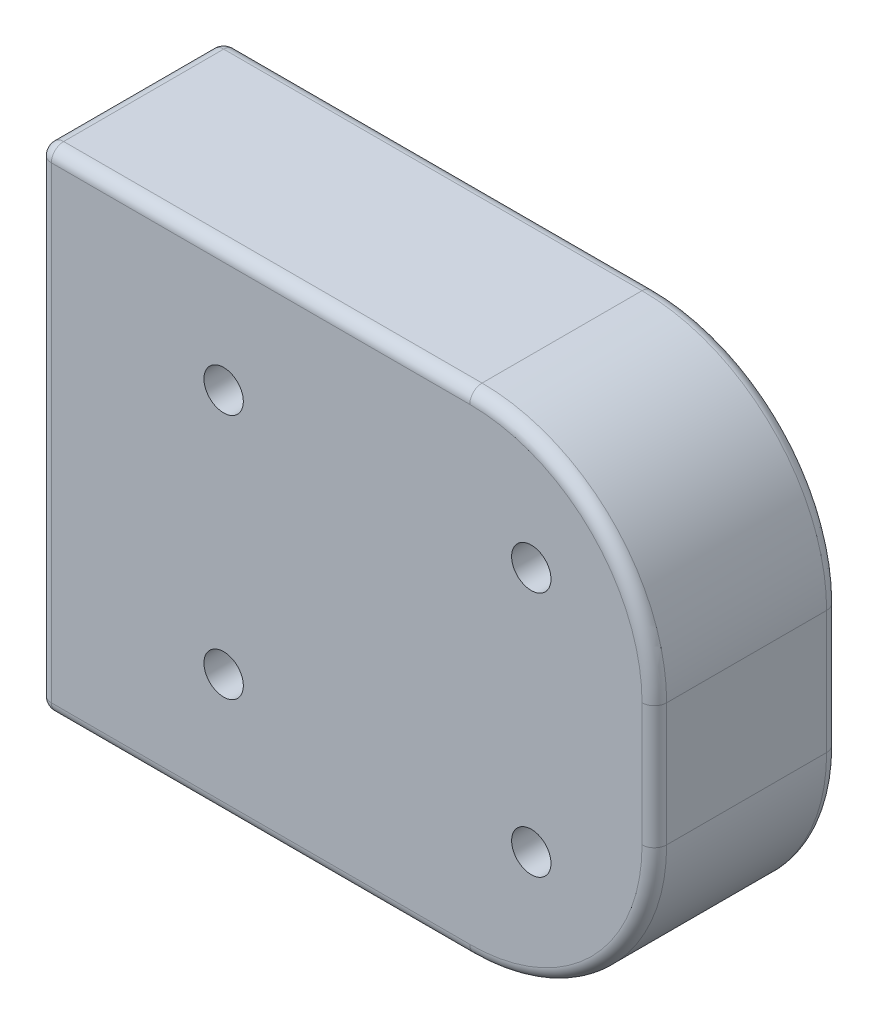
ISO-10303-21;
HEADER;
FILE_DESCRIPTION(('STEP AP214'),'2;1');
FILE_NAME('part.step','',(''),(''),'','','');
FILE_SCHEMA(('AUTOMOTIVE_DESIGN { 1 0 10303 214 1 1 1 1 }'));
ENDSEC;
DATA;
#1=APPLICATION_CONTEXT('core data for automotive mechanical design processes');
#2=APPLICATION_PROTOCOL_DEFINITION('international standard','automotive_design',2000,#1);
#3=PRODUCT_CONTEXT('',#1,'mechanical');
#4=PRODUCT('Part','Part','',(#3));
#5=PRODUCT_RELATED_PRODUCT_CATEGORY('part','',(#4));
#6=PRODUCT_DEFINITION_FORMATION('','',#4);
#7=PRODUCT_DEFINITION_CONTEXT('part definition',#1,'design');
#8=PRODUCT_DEFINITION('design','',#6,#7);
#9=PRODUCT_DEFINITION_SHAPE('','',#8);
#10=(LENGTH_UNIT() NAMED_UNIT(*) SI_UNIT(.MILLI.,.METRE.));
#11=(NAMED_UNIT(*) PLANE_ANGLE_UNIT() SI_UNIT($,.RADIAN.));
#12=(NAMED_UNIT(*) SI_UNIT($,.STERADIAN.) SOLID_ANGLE_UNIT());
#13=UNCERTAINTY_MEASURE_WITH_UNIT(LENGTH_MEASURE(1.E-05),#10,'distance_accuracy_value','');
#14=(GEOMETRIC_REPRESENTATION_CONTEXT(3) GLOBAL_UNCERTAINTY_ASSIGNED_CONTEXT((#13)) GLOBAL_UNIT_ASSIGNED_CONTEXT((#10,
#11,#12)) REPRESENTATION_CONTEXT('',''));
#15=CARTESIAN_POINT('',(0.,0.,0.));
#16=DIRECTION('',(0.,0.,1.));
#17=DIRECTION('',(1.,0.,0.));
#18=AXIS2_PLACEMENT_3D('',#15,#16,#17);
#19=CARTESIAN_POINT('',(25.,-20.,15.));
#20=DIRECTION('',(-1.,0.,0.));
#21=DIRECTION('',(0.,0.,1.));
#22=AXIS2_PLACEMENT_3D('',#19,#20,#21);
#23=PLANE('',#22);
#24=DIRECTION('',(0.,0.,-1.));
#25=VECTOR('',#24,1.);
#26=CARTESIAN_POINT('',(25.,-5.,15.));
#27=LINE('',#26,#25);
#28=CARTESIAN_POINT('',(25.,-5.,14.));
#29=VERTEX_POINT('',#28);
#30=CARTESIAN_POINT('',(25.,-5.,1.));
#31=VERTEX_POINT('',#30);
#32=EDGE_CURVE('E291',#29,#31,#27,.T.);
#33=ORIENTED_EDGE('',*,*,#32,.T.);
#34=DIRECTION('',(0.,1.,0.));
#35=VECTOR('',#34,1.);
#36=CARTESIAN_POINT('',(25.,5.,1.));
#37=LINE('',#36,#35);
#38=CARTESIAN_POINT('',(25.,5.,1.));
#39=VERTEX_POINT('',#38);
#40=EDGE_CURVE('E197',#31,#39,#37,.T.);
#41=ORIENTED_EDGE('',*,*,#40,.T.);
#42=DIRECTION('',(0.,0.,-1.));
#43=VECTOR('',#42,1.);
#44=CARTESIAN_POINT('',(25.,5.,15.));
#45=LINE('',#44,#43);
#46=CARTESIAN_POINT('',(25.,5.,14.));
#47=VERTEX_POINT('',#46);
#48=EDGE_CURVE('E294',#39,#47,#45,.F.);
#49=ORIENTED_EDGE('',*,*,#48,.T.);
#50=DIRECTION('',(0.,1.,0.));
#51=VECTOR('',#50,1.);
#52=CARTESIAN_POINT('',(25.,-20.,14.));
#53=LINE('',#52,#51);
#54=EDGE_CURVE('E195',#47,#29,#53,.F.);
#55=ORIENTED_EDGE('',*,*,#54,.T.);
#56=EDGE_LOOP('',(#33,#41,#49,#55));
#57=FACE_BOUND('',#56,.T.);
#58=ADVANCED_FACE('F38',(#57),#23,.F.);
#59=CARTESIAN_POINT('',(-25.,20.,15.));
#60=DIRECTION('',(0.,-1.,0.));
#61=DIRECTION('',(0.,0.,-1.));
#62=AXIS2_PLACEMENT_3D('',#59,#60,#61);
#63=PLANE('',#62);
#64=DIRECTION('',(0.,0.,-1.));
#65=VECTOR('',#64,1.);
#66=CARTESIAN_POINT('',(10.,20.,15.));
#67=LINE('',#66,#65);
#68=CARTESIAN_POINT('',(10.,20.,14.));
#69=VERTEX_POINT('',#68);
#70=CARTESIAN_POINT('',(10.,20.,1.));
#71=VERTEX_POINT('',#70);
#72=EDGE_CURVE('E285',#69,#71,#67,.T.);
#73=ORIENTED_EDGE('',*,*,#72,.T.);
#74=DIRECTION('',(-1.,0.,0.));
#75=VECTOR('',#74,1.);
#76=CARTESIAN_POINT('',(-24.,20.,1.));
#77=LINE('',#76,#75);
#78=CARTESIAN_POINT('',(-24.,20.,1.));
#79=VERTEX_POINT('',#78);
#80=EDGE_CURVE('E11',#71,#79,#77,.T.);
#81=ORIENTED_EDGE('',*,*,#80,.T.);
#82=DIRECTION('',(0.,0.,-1.));
#83=VECTOR('',#82,1.);
#84=CARTESIAN_POINT('',(-24.,20.,15.));
#85=LINE('',#84,#83);
#86=CARTESIAN_POINT('',(-24.,20.,14.));
#87=VERTEX_POINT('',#86);
#88=EDGE_CURVE('E175',#79,#87,#85,.F.);
#89=ORIENTED_EDGE('',*,*,#88,.T.);
#90=DIRECTION('',(-1.,0.,0.));
#91=VECTOR('',#90,1.);
#92=CARTESIAN_POINT('',(-25.,20.,14.));
#93=LINE('',#92,#91);
#94=EDGE_CURVE('E47',#87,#69,#93,.F.);
#95=ORIENTED_EDGE('',*,*,#94,.T.);
#96=EDGE_LOOP('',(#73,#81,#89,#95));
#97=FACE_BOUND('',#96,.T.);
#98=ADVANCED_FACE('F348',(#97),#63,.F.);
#99=CARTESIAN_POINT('',(-25.,-20.,15.));
#100=DIRECTION('',(1.,0.,0.));
#101=DIRECTION('',(0.,0.,-1.));
#102=AXIS2_PLACEMENT_3D('',#99,#100,#101);
#103=PLANE('',#102);
#104=DIRECTION('',(0.,0.,-1.));
#105=VECTOR('',#104,1.);
#106=CARTESIAN_POINT('',(-25.,19.,15.));
#107=LINE('',#106,#105);
#108=CARTESIAN_POINT('',(-25.,19.,14.));
#109=VERTEX_POINT('',#108);
#110=CARTESIAN_POINT('',(-25.,19.,1.));
#111=VERTEX_POINT('',#110);
#112=EDGE_CURVE('E281',#109,#111,#107,.T.);
#113=ORIENTED_EDGE('',*,*,#112,.T.);
#114=DIRECTION('',(0.,-1.,0.));
#115=VECTOR('',#114,1.);
#116=CARTESIAN_POINT('',(-25.,-19.,1.));
#117=LINE('',#116,#115);
#118=CARTESIAN_POINT('',(-25.,-19.,1.));
#119=VERTEX_POINT('',#118);
#120=EDGE_CURVE('E158',#111,#119,#117,.T.);
#121=ORIENTED_EDGE('',*,*,#120,.T.);
#122=DIRECTION('',(0.,0.,-1.));
#123=VECTOR('',#122,1.);
#124=CARTESIAN_POINT('',(-25.,-19.,15.));
#125=LINE('',#124,#123);
#126=CARTESIAN_POINT('',(-25.,-19.,14.));
#127=VERTEX_POINT('',#126);
#128=EDGE_CURVE('E178',#119,#127,#125,.F.);
#129=ORIENTED_EDGE('',*,*,#128,.T.);
#130=DIRECTION('',(0.,-1.,0.));
#131=VECTOR('',#130,1.);
#132=CARTESIAN_POINT('',(-25.,-20.,14.));
#133=LINE('',#132,#131);
#134=EDGE_CURVE('E211',#127,#109,#133,.F.);
#135=ORIENTED_EDGE('',*,*,#134,.T.);
#136=EDGE_LOOP('',(#113,#121,#129,#135));
#137=FACE_BOUND('',#136,.T.);
#138=ADVANCED_FACE('F279',(#137),#103,.F.);
#139=CARTESIAN_POINT('',(-25.,-20.,15.));
#140=DIRECTION('',(0.,1.,0.));
#141=DIRECTION('',(0.,0.,1.));
#142=AXIS2_PLACEMENT_3D('',#139,#140,#141);
#143=PLANE('',#142);
#144=DIRECTION('',(0.,0.,-1.));
#145=VECTOR('',#144,1.);
#146=CARTESIAN_POINT('',(-24.,-20.,15.));
#147=LINE('',#146,#145);
#148=CARTESIAN_POINT('',(-24.,-20.,14.));
#149=VERTEX_POINT('',#148);
#150=CARTESIAN_POINT('',(-24.,-20.,1.));
#151=VERTEX_POINT('',#150);
#152=EDGE_CURVE('E276',#149,#151,#147,.T.);
#153=ORIENTED_EDGE('',*,*,#152,.T.);
#154=DIRECTION('',(1.,0.,0.));
#155=VECTOR('',#154,1.);
#156=CARTESIAN_POINT('',(10.,-20.,1.));
#157=LINE('',#156,#155);
#158=CARTESIAN_POINT('',(10.,-20.,1.));
#159=VERTEX_POINT('',#158);
#160=EDGE_CURVE('E205',#151,#159,#157,.T.);
#161=ORIENTED_EDGE('',*,*,#160,.T.);
#162=DIRECTION('',(0.,0.,-1.));
#163=VECTOR('',#162,1.);
#164=CARTESIAN_POINT('',(10.,-20.,15.));
#165=LINE('',#164,#163);
#166=CARTESIAN_POINT('',(10.,-20.,14.));
#167=VERTEX_POINT('',#166);
#168=EDGE_CURVE('E288',#159,#167,#165,.F.);
#169=ORIENTED_EDGE('',*,*,#168,.T.);
#170=DIRECTION('',(1.,0.,0.));
#171=VECTOR('',#170,1.);
#172=CARTESIAN_POINT('',(-25.,-20.,14.));
#173=LINE('',#172,#171);
#174=EDGE_CURVE('E203',#167,#149,#173,.F.);
#175=ORIENTED_EDGE('',*,*,#174,.T.);
#176=EDGE_LOOP('',(#153,#161,#169,#175));
#177=FACE_BOUND('',#176,.T.);
#178=ADVANCED_FACE('F334',(#177),#143,.F.);
#179=CARTESIAN_POINT('',(0.,0.,15.));
#180=DIRECTION('',(0.,0.,-1.));
#181=DIRECTION('',(-1.,0.,0.));
#182=AXIS2_PLACEMENT_3D('',#179,#180,#181);
#183=PLANE('',#182);
#184=DIRECTION('',(0.,1.,0.));
#185=VECTOR('',#184,1.);
#186=CARTESIAN_POINT('',(24.,0.,15.));
#187=LINE('',#186,#185);
#188=CARTESIAN_POINT('',(24.,-5.,15.));
#189=VERTEX_POINT('',#188);
#190=CARTESIAN_POINT('',(24.,5.,15.));
#191=VERTEX_POINT('',#190);
#192=EDGE_CURVE('E55',#189,#191,#187,.T.);
#193=ORIENTED_EDGE('',*,*,#192,.T.);
#194=CARTESIAN_POINT('',(10.,5.,15.));
#195=DIRECTION('',(0.,0.,-1.));
#196=DIRECTION('',(-1.,0.,0.));
#197=AXIS2_PLACEMENT_3D('',#194,#195,#196);
#198=CIRCLE('',#197,14.);
#199=CARTESIAN_POINT('',(10.,19.,15.));
#200=VERTEX_POINT('',#199);
#201=EDGE_CURVE('E225',#191,#200,#198,.F.);
#202=ORIENTED_EDGE('',*,*,#201,.T.);
#203=DIRECTION('',(-1.,0.,0.));
#204=VECTOR('',#203,1.);
#205=CARTESIAN_POINT('',(0.,19.,15.));
#206=LINE('',#205,#204);
#207=CARTESIAN_POINT('',(-24.,19.,15.));
#208=VERTEX_POINT('',#207);
#209=EDGE_CURVE('E217',#200,#208,#206,.T.);
#210=ORIENTED_EDGE('',*,*,#209,.T.);
#211=DIRECTION('',(0.,-1.,0.));
#212=VECTOR('',#211,1.);
#213=CARTESIAN_POINT('',(-24.,0.,15.));
#214=LINE('',#213,#212);
#215=CARTESIAN_POINT('',(-24.,-19.,15.));
#216=VERTEX_POINT('',#215);
#217=EDGE_CURVE('E219',#208,#216,#214,.T.);
#218=ORIENTED_EDGE('',*,*,#217,.T.);
#219=DIRECTION('',(1.,0.,0.));
#220=VECTOR('',#219,1.);
#221=CARTESIAN_POINT('',(0.,-19.,15.));
#222=LINE('',#221,#220);
#223=CARTESIAN_POINT('',(10.,-19.,15.));
#224=VERTEX_POINT('',#223);
#225=EDGE_CURVE('E221',#216,#224,#222,.T.);
#226=ORIENTED_EDGE('',*,*,#225,.T.);
#227=CARTESIAN_POINT('',(10.,-5.,15.));
#228=DIRECTION('',(0.,0.,-1.));
#229=DIRECTION('',(-1.,0.,0.));
#230=AXIS2_PLACEMENT_3D('',#227,#228,#229);
#231=CIRCLE('',#230,14.);
#232=EDGE_CURVE('E60',#224,#189,#231,.F.);
#233=ORIENTED_EDGE('',*,*,#232,.T.);
#234=EDGE_LOOP('',(#193,#202,#210,#218,#226,#233));
#235=FACE_BOUND('',#234,.T.);
#236=CARTESIAN_POINT('',(-10.,-10.,15.));
#237=DIRECTION('',(0.,0.,1.));
#238=DIRECTION('',(-1.,0.,0.));
#239=AXIS2_PLACEMENT_3D('',#236,#237,#238);
#240=CIRCLE('',#239,1.59999999999998);
#241=CARTESIAN_POINT('',(-11.6,-10.,15.));
#242=VERTEX_POINT('',#241);
#243=EDGE_CURVE('E238',#242,#242,#240,.T.);
#244=ORIENTED_EDGE('',*,*,#243,.F.);
#245=EDGE_LOOP('',(#244));
#246=FACE_BOUND('',#245,.T.);
#247=CARTESIAN_POINT('',(15.,-10.,15.));
#248=DIRECTION('',(0.,0.,1.));
#249=DIRECTION('',(1.,0.,0.));
#250=AXIS2_PLACEMENT_3D('',#247,#248,#249);
#251=CIRCLE('',#250,1.60000000000001);
#252=CARTESIAN_POINT('',(16.6,-10.,15.));
#253=VERTEX_POINT('',#252);
#254=EDGE_CURVE('E309',#253,#253,#251,.T.);
#255=ORIENTED_EDGE('',*,*,#254,.F.);
#256=EDGE_LOOP('',(#255));
#257=FACE_BOUND('',#256,.T.);
#258=CARTESIAN_POINT('',(15.,10.,15.));
#259=DIRECTION('',(0.,0.,1.));
#260=DIRECTION('',(-1.,0.,0.));
#261=AXIS2_PLACEMENT_3D('',#258,#259,#260);
#262=CIRCLE('',#261,1.6);
#263=CARTESIAN_POINT('',(13.4,10.,15.));
#264=VERTEX_POINT('',#263);
#265=EDGE_CURVE('E315',#264,#264,#262,.T.);
#266=ORIENTED_EDGE('',*,*,#265,.F.);
#267=EDGE_LOOP('',(#266));
#268=FACE_BOUND('',#267,.T.);
#269=CARTESIAN_POINT('',(-10.,10.,15.));
#270=DIRECTION('',(0.,0.,1.));
#271=DIRECTION('',(1.,0.,0.));
#272=AXIS2_PLACEMENT_3D('',#269,#270,#271);
#273=CIRCLE('',#272,1.6);
#274=CARTESIAN_POINT('',(-8.4,10.,15.));
#275=VERTEX_POINT('',#274);
#276=EDGE_CURVE('E298',#275,#275,#273,.T.);
#277=ORIENTED_EDGE('',*,*,#276,.F.);
#278=EDGE_LOOP('',(#277));
#279=FACE_BOUND('',#278,.T.);
#280=ADVANCED_FACE('F331',(#235,#246,#257,#268,#279),#183,.F.);
#281=CARTESIAN_POINT('',(0.,0.,0.));
#282=DIRECTION('',(0.,0.,-1.));
#283=DIRECTION('',(-1.,0.,0.));
#284=AXIS2_PLACEMENT_3D('',#281,#282,#283);
#285=PLANE('',#284);
#286=DIRECTION('',(-1.,0.,0.));
#287=VECTOR('',#286,1.);
#288=CARTESIAN_POINT('',(10.,19.,0.));
#289=LINE('',#288,#287);
#290=CARTESIAN_POINT('',(-24.,19.,0.));
#291=VERTEX_POINT('',#290);
#292=CARTESIAN_POINT('',(10.,19.,0.));
#293=VERTEX_POINT('',#292);
#294=EDGE_CURVE('E145',#291,#293,#289,.F.);
#295=ORIENTED_EDGE('',*,*,#294,.T.);
#296=CARTESIAN_POINT('',(10.,5.,0.));
#297=DIRECTION('',(0.,0.,-1.));
#298=DIRECTION('',(-1.,0.,0.));
#299=AXIS2_PLACEMENT_3D('',#296,#297,#298);
#300=CIRCLE('',#299,14.);
#301=CARTESIAN_POINT('',(24.,5.,0.));
#302=VERTEX_POINT('',#301);
#303=EDGE_CURVE('E187',#293,#302,#300,.T.);
#304=ORIENTED_EDGE('',*,*,#303,.T.);
#305=DIRECTION('',(0.,1.,0.));
#306=VECTOR('',#305,1.);
#307=CARTESIAN_POINT('',(24.,-5.,0.));
#308=LINE('',#307,#306);
#309=CARTESIAN_POINT('',(24.,-5.,0.));
#310=VERTEX_POINT('',#309);
#311=EDGE_CURVE('E185',#302,#310,#308,.F.);
#312=ORIENTED_EDGE('',*,*,#311,.T.);
#313=CARTESIAN_POINT('',(10.,-5.,0.));
#314=DIRECTION('',(0.,0.,-1.));
#315=DIRECTION('',(-1.,0.,0.));
#316=AXIS2_PLACEMENT_3D('',#313,#314,#315);
#317=CIRCLE('',#316,14.);
#318=CARTESIAN_POINT('',(10.,-19.,0.));
#319=VERTEX_POINT('',#318);
#320=EDGE_CURVE('E183',#310,#319,#317,.T.);
#321=ORIENTED_EDGE('',*,*,#320,.T.);
#322=DIRECTION('',(1.,0.,0.));
#323=VECTOR('',#322,1.);
#324=CARTESIAN_POINT('',(-24.,-19.,0.));
#325=LINE('',#324,#323);
#326=CARTESIAN_POINT('',(-24.,-19.,0.));
#327=VERTEX_POINT('',#326);
#328=EDGE_CURVE('E148',#319,#327,#325,.F.);
#329=ORIENTED_EDGE('',*,*,#328,.T.);
#330=DIRECTION('',(0.,-1.,0.));
#331=VECTOR('',#330,1.);
#332=CARTESIAN_POINT('',(-24.,19.,0.));
#333=LINE('',#332,#331);
#334=EDGE_CURVE('E139',#327,#291,#333,.F.);
#335=ORIENTED_EDGE('',*,*,#334,.T.);
#336=EDGE_LOOP('',(#295,#304,#312,#321,#329,#335));
#337=FACE_BOUND('',#336,.T.);
#338=CARTESIAN_POINT('',(-10.,-10.,0.));
#339=DIRECTION('',(0.,0.,1.));
#340=DIRECTION('',(-1.,0.,0.));
#341=AXIS2_PLACEMENT_3D('',#338,#339,#340);
#342=CIRCLE('',#341,1.59999999999998);
#343=CARTESIAN_POINT('',(-11.6,-10.,0.));
#344=VERTEX_POINT('',#343);
#345=EDGE_CURVE('E306',#344,#344,#342,.T.);
#346=ORIENTED_EDGE('',*,*,#345,.T.);
#347=EDGE_LOOP('',(#346));
#348=FACE_BOUND('',#347,.T.);
#349=CARTESIAN_POINT('',(15.,-10.,0.));
#350=DIRECTION('',(0.,0.,1.));
#351=DIRECTION('',(1.,0.,0.));
#352=AXIS2_PLACEMENT_3D('',#349,#350,#351);
#353=CIRCLE('',#352,1.60000000000001);
#354=CARTESIAN_POINT('',(16.6,-10.,0.));
#355=VERTEX_POINT('',#354);
#356=EDGE_CURVE('E312',#355,#355,#353,.T.);
#357=ORIENTED_EDGE('',*,*,#356,.T.);
#358=EDGE_LOOP('',(#357));
#359=FACE_BOUND('',#358,.T.);
#360=CARTESIAN_POINT('',(15.,10.,0.));
#361=DIRECTION('',(0.,0.,1.));
#362=DIRECTION('',(-1.,0.,0.));
#363=AXIS2_PLACEMENT_3D('',#360,#361,#362);
#364=CIRCLE('',#363,1.6);
#365=CARTESIAN_POINT('',(13.4,10.,0.));
#366=VERTEX_POINT('',#365);
#367=EDGE_CURVE('E301',#366,#366,#364,.T.);
#368=ORIENTED_EDGE('',*,*,#367,.T.);
#369=EDGE_LOOP('',(#368));
#370=FACE_BOUND('',#369,.T.);
#371=CARTESIAN_POINT('',(-10.,10.,0.));
#372=DIRECTION('',(0.,0.,1.));
#373=DIRECTION('',(1.,0.,0.));
#374=AXIS2_PLACEMENT_3D('',#371,#372,#373);
#375=CIRCLE('',#374,1.6);
#376=CARTESIAN_POINT('',(-8.4,10.,0.));
#377=VERTEX_POINT('',#376);
#378=EDGE_CURVE('E297',#377,#377,#375,.T.);
#379=ORIENTED_EDGE('',*,*,#378,.T.);
#380=EDGE_LOOP('',(#379));
#381=FACE_BOUND('',#380,.T.);
#382=ADVANCED_FACE('F141',(#337,#348,#359,#370,#381),#285,.T.);
#383=CARTESIAN_POINT('',(-10.,10.,0.));
#384=DIRECTION('',(0.,0.,1.));
#385=DIRECTION('',(1.,0.,0.));
#386=AXIS2_PLACEMENT_3D('',#383,#384,#385);
#387=CYLINDRICAL_SURFACE('',#386,1.6);
#388=ORIENTED_EDGE('',*,*,#378,.F.);
#389=EDGE_LOOP('',(#388));
#390=FACE_BOUND('',#389,.T.);
#391=ORIENTED_EDGE('',*,*,#276,.T.);
#392=EDGE_LOOP('',(#391));
#393=FACE_BOUND('',#392,.T.);
#394=ADVANCED_FACE('F327',(#390,#393),#387,.F.);
#395=CARTESIAN_POINT('',(15.,10.,0.));
#396=DIRECTION('',(0.,0.,1.));
#397=DIRECTION('',(1.,0.,0.));
#398=AXIS2_PLACEMENT_3D('',#395,#396,#397);
#399=CYLINDRICAL_SURFACE('',#398,1.6);
#400=ORIENTED_EDGE('',*,*,#367,.F.);
#401=EDGE_LOOP('',(#400));
#402=FACE_BOUND('',#401,.T.);
#403=ORIENTED_EDGE('',*,*,#265,.T.);
#404=EDGE_LOOP('',(#403));
#405=FACE_BOUND('',#404,.T.);
#406=ADVANCED_FACE('F323',(#402,#405),#399,.F.);
#407=CARTESIAN_POINT('',(15.,-10.,0.));
#408=DIRECTION('',(0.,0.,1.));
#409=DIRECTION('',(1.,0.,0.));
#410=AXIS2_PLACEMENT_3D('',#407,#408,#409);
#411=CYLINDRICAL_SURFACE('',#410,1.60000000000001);
#412=ORIENTED_EDGE('',*,*,#356,.F.);
#413=EDGE_LOOP('',(#412));
#414=FACE_BOUND('',#413,.T.);
#415=ORIENTED_EDGE('',*,*,#254,.T.);
#416=EDGE_LOOP('',(#415));
#417=FACE_BOUND('',#416,.T.);
#418=ADVANCED_FACE('F326',(#414,#417),#411,.F.);
#419=CARTESIAN_POINT('',(-10.,-10.,0.));
#420=DIRECTION('',(0.,0.,1.));
#421=DIRECTION('',(1.,0.,0.));
#422=AXIS2_PLACEMENT_3D('',#419,#420,#421);
#423=CYLINDRICAL_SURFACE('',#422,1.59999999999998);
#424=ORIENTED_EDGE('',*,*,#345,.F.);
#425=EDGE_LOOP('',(#424));
#426=FACE_BOUND('',#425,.T.);
#427=ORIENTED_EDGE('',*,*,#243,.T.);
#428=EDGE_LOOP('',(#427));
#429=FACE_BOUND('',#428,.T.);
#430=ADVANCED_FACE('F362',(#426,#429),#423,.F.);
#431=CARTESIAN_POINT('',(10.,-5.,15.));
#432=DIRECTION('',(0.,0.,-1.));
#433=DIRECTION('',(-1.,0.,0.));
#434=AXIS2_PLACEMENT_3D('',#431,#432,#433);
#435=CYLINDRICAL_SURFACE('',#434,15.);
#436=ORIENTED_EDGE('',*,*,#168,.F.);
#437=CARTESIAN_POINT('',(10.,-5.,1.));
#438=DIRECTION('',(0.,0.,-1.));
#439=DIRECTION('',(-1.,0.,0.));
#440=AXIS2_PLACEMENT_3D('',#437,#438,#439);
#441=CIRCLE('',#440,15.);
#442=EDGE_CURVE('E201',#159,#31,#441,.F.);
#443=ORIENTED_EDGE('',*,*,#442,.T.);
#444=ORIENTED_EDGE('',*,*,#32,.F.);
#445=CARTESIAN_POINT('',(10.,-5.,14.));
#446=DIRECTION('',(0.,0.,-1.));
#447=DIRECTION('',(-1.,0.,0.));
#448=AXIS2_PLACEMENT_3D('',#445,#446,#447);
#449=CIRCLE('',#448,15.);
#450=EDGE_CURVE('E199',#29,#167,#449,.T.);
#451=ORIENTED_EDGE('',*,*,#450,.T.);
#452=EDGE_LOOP('',(#436,#443,#444,#451));
#453=FACE_BOUND('',#452,.T.);
#454=ADVANCED_FACE('F358',(#453),#435,.T.);
#455=CARTESIAN_POINT('',(10.,5.,15.));
#456=DIRECTION('',(0.,0.,-1.));
#457=DIRECTION('',(-1.,0.,0.));
#458=AXIS2_PLACEMENT_3D('',#455,#456,#457);
#459=CYLINDRICAL_SURFACE('',#458,15.);
#460=ORIENTED_EDGE('',*,*,#48,.F.);
#461=CARTESIAN_POINT('',(10.,5.,1.));
#462=DIRECTION('',(0.,0.,-1.));
#463=DIRECTION('',(-1.,0.,0.));
#464=AXIS2_PLACEMENT_3D('',#461,#462,#463);
#465=CIRCLE('',#464,15.);
#466=EDGE_CURVE('E192',#39,#71,#465,.F.);
#467=ORIENTED_EDGE('',*,*,#466,.T.);
#468=ORIENTED_EDGE('',*,*,#72,.F.);
#469=CARTESIAN_POINT('',(10.,5.,14.));
#470=DIRECTION('',(0.,0.,-1.));
#471=DIRECTION('',(-1.,0.,0.));
#472=AXIS2_PLACEMENT_3D('',#469,#470,#471);
#473=CIRCLE('',#472,15.);
#474=EDGE_CURVE('E189',#69,#47,#473,.T.);
#475=ORIENTED_EDGE('',*,*,#474,.T.);
#476=EDGE_LOOP('',(#460,#467,#468,#475));
#477=FACE_BOUND('',#476,.T.);
#478=ADVANCED_FACE('F361',(#477),#459,.T.);
#479=CARTESIAN_POINT('',(-24.,-19.,15.));
#480=DIRECTION('',(0.,0.,-1.));
#481=DIRECTION('',(-1.,0.,0.));
#482=AXIS2_PLACEMENT_3D('',#479,#480,#481);
#483=CYLINDRICAL_SURFACE('',#482,1.);
#484=ORIENTED_EDGE('',*,*,#128,.F.);
#485=CARTESIAN_POINT('',(-24.,-19.,1.));
#486=DIRECTION('',(0.,0.,-1.));
#487=DIRECTION('',(-1.,0.,0.));
#488=AXIS2_PLACEMENT_3D('',#485,#486,#487);
#489=CIRCLE('',#488,1.);
#490=EDGE_CURVE('E209',#119,#151,#489,.F.);
#491=ORIENTED_EDGE('',*,*,#490,.T.);
#492=ORIENTED_EDGE('',*,*,#152,.F.);
#493=CARTESIAN_POINT('',(-24.,-19.,14.));
#494=DIRECTION('',(0.,0.,-1.));
#495=DIRECTION('',(-1.,0.,0.));
#496=AXIS2_PLACEMENT_3D('',#493,#494,#495);
#497=CIRCLE('',#496,1.);
#498=EDGE_CURVE('E207',#149,#127,#497,.T.);
#499=ORIENTED_EDGE('',*,*,#498,.T.);
#500=EDGE_LOOP('',(#484,#491,#492,#499));
#501=FACE_BOUND('',#500,.T.);
#502=ADVANCED_FACE('F273',(#501),#483,.T.);
#503=CARTESIAN_POINT('',(-24.,19.,15.));
#504=DIRECTION('',(0.,0.,-1.));
#505=DIRECTION('',(-1.,0.,0.));
#506=AXIS2_PLACEMENT_3D('',#503,#504,#505);
#507=CYLINDRICAL_SURFACE('',#506,1.);
#508=ORIENTED_EDGE('',*,*,#88,.F.);
#509=CARTESIAN_POINT('',(-24.,19.,1.));
#510=DIRECTION('',(0.,0.,-1.));
#511=DIRECTION('',(-1.,0.,0.));
#512=AXIS2_PLACEMENT_3D('',#509,#510,#511);
#513=CIRCLE('',#512,1.);
#514=EDGE_CURVE('E167',#79,#111,#513,.F.);
#515=ORIENTED_EDGE('',*,*,#514,.T.);
#516=ORIENTED_EDGE('',*,*,#112,.F.);
#517=CARTESIAN_POINT('',(-24.,19.,14.));
#518=DIRECTION('',(0.,0.,-1.));
#519=DIRECTION('',(-1.,0.,0.));
#520=AXIS2_PLACEMENT_3D('',#517,#518,#519);
#521=CIRCLE('',#520,1.);
#522=EDGE_CURVE('E214',#109,#87,#521,.T.);
#523=ORIENTED_EDGE('',*,*,#522,.T.);
#524=EDGE_LOOP('',(#508,#515,#516,#523));
#525=FACE_BOUND('',#524,.T.);
#526=ADVANCED_FACE('F369',(#525),#507,.T.);
#527=CARTESIAN_POINT('',(-24.,-19.,1.));
#528=DIRECTION('',(0.,0.,-1.));
#529=DIRECTION('',(-1.,0.,0.));
#530=AXIS2_PLACEMENT_3D('',#527,#528,#529);
#531=SPHERICAL_SURFACE('',#530,1.);
#532=CARTESIAN_POINT('',(-24.,-19.,1.));
#533=DIRECTION('',(1.,0.,0.));
#534=DIRECTION('',(0.,0.,-1.));
#535=AXIS2_PLACEMENT_3D('',#532,#533,#534);
#536=CIRCLE('',#535,1.);
#537=EDGE_CURVE('E161',#151,#327,#536,.T.);
#538=ORIENTED_EDGE('',*,*,#537,.F.);
#539=ORIENTED_EDGE('',*,*,#490,.F.);
#540=CARTESIAN_POINT('',(-24.,-19.,1.));
#541=DIRECTION('',(0.,1.,0.));
#542=DIRECTION('',(0.,0.,1.));
#543=AXIS2_PLACEMENT_3D('',#540,#541,#542);
#544=CIRCLE('',#543,1.);
#545=EDGE_CURVE('E236',#327,#119,#544,.T.);
#546=ORIENTED_EDGE('',*,*,#545,.F.);
#547=EDGE_LOOP('',(#538,#539,#546));
#548=FACE_BOUND('',#547,.T.);
#549=ADVANCED_FACE('F372',(#548),#531,.T.);
#550=CARTESIAN_POINT('',(-24.,-20.,1.));
#551=DIRECTION('',(0.,1.,0.));
#552=DIRECTION('',(0.,0.,1.));
#553=AXIS2_PLACEMENT_3D('',#550,#551,#552);
#554=CYLINDRICAL_SURFACE('',#553,1.);
#555=ORIENTED_EDGE('',*,*,#545,.T.);
#556=ORIENTED_EDGE('',*,*,#120,.F.);
#557=CARTESIAN_POINT('',(-24.,19.,1.));
#558=DIRECTION('',(0.,1.,0.));
#559=DIRECTION('',(0.,0.,1.));
#560=AXIS2_PLACEMENT_3D('',#557,#558,#559);
#561=CIRCLE('',#560,1.);
#562=EDGE_CURVE('E155',#291,#111,#561,.T.);
#563=ORIENTED_EDGE('',*,*,#562,.F.);
#564=ORIENTED_EDGE('',*,*,#334,.F.);
#565=EDGE_LOOP('',(#555,#556,#563,#564));
#566=FACE_BOUND('',#565,.T.);
#567=ADVANCED_FACE('F157',(#566),#554,.T.);
#568=CARTESIAN_POINT('',(-25.,-19.,1.));
#569=DIRECTION('',(-1.,0.,0.));
#570=DIRECTION('',(0.,0.,1.));
#571=AXIS2_PLACEMENT_3D('',#568,#569,#570);
#572=CYLINDRICAL_SURFACE('',#571,1.);
#573=ORIENTED_EDGE('',*,*,#537,.T.);
#574=ORIENTED_EDGE('',*,*,#328,.F.);
#575=CARTESIAN_POINT('',(10.,-19.,1.));
#576=DIRECTION('',(1.,0.,0.));
#577=DIRECTION('',(0.,0.,-1.));
#578=AXIS2_PLACEMENT_3D('',#575,#576,#577);
#579=CIRCLE('',#578,1.);
#580=EDGE_CURVE('E162',#159,#319,#579,.T.);
#581=ORIENTED_EDGE('',*,*,#580,.F.);
#582=ORIENTED_EDGE('',*,*,#160,.F.);
#583=EDGE_LOOP('',(#573,#574,#581,#582));
#584=FACE_BOUND('',#583,.T.);
#585=ADVANCED_FACE('F390',(#584),#572,.T.);
#586=CARTESIAN_POINT('',(-24.,19.,1.));
#587=DIRECTION('',(0.,0.,-1.));
#588=DIRECTION('',(-1.,0.,0.));
#589=AXIS2_PLACEMENT_3D('',#586,#587,#588);
#590=SPHERICAL_SURFACE('',#589,1.);
#591=ORIENTED_EDGE('',*,*,#562,.T.);
#592=ORIENTED_EDGE('',*,*,#514,.F.);
#593=CARTESIAN_POINT('',(-24.,19.,1.));
#594=DIRECTION('',(1.,0.,0.));
#595=DIRECTION('',(0.,0.,-1.));
#596=AXIS2_PLACEMENT_3D('',#593,#594,#595);
#597=CIRCLE('',#596,1.);
#598=EDGE_CURVE('E165',#291,#79,#597,.T.);
#599=ORIENTED_EDGE('',*,*,#598,.F.);
#600=EDGE_LOOP('',(#591,#592,#599));
#601=FACE_BOUND('',#600,.T.);
#602=ADVANCED_FACE('F166',(#601),#590,.T.);
#603=CARTESIAN_POINT('',(10.,-5.,1.));
#604=DIRECTION('',(0.,0.,-1.));
#605=DIRECTION('',(-1.,0.,0.));
#606=AXIS2_PLACEMENT_3D('',#603,#604,#605);
#607=TOROIDAL_SURFACE('',#606,14.,1.);
#608=ORIENTED_EDGE('',*,*,#580,.T.);
#609=ORIENTED_EDGE('',*,*,#320,.F.);
#610=CARTESIAN_POINT('',(24.,-5.,1.));
#611=DIRECTION('',(0.,1.,0.));
#612=DIRECTION('',(0.,0.,1.));
#613=AXIS2_PLACEMENT_3D('',#610,#611,#612);
#614=CIRCLE('',#613,1.);
#615=EDGE_CURVE('E170',#31,#310,#614,.T.);
#616=ORIENTED_EDGE('',*,*,#615,.F.);
#617=ORIENTED_EDGE('',*,*,#442,.F.);
#618=EDGE_LOOP('',(#608,#609,#616,#617));
#619=FACE_BOUND('',#618,.T.);
#620=ADVANCED_FACE('F384',(#619),#607,.T.);
#621=CARTESIAN_POINT('',(-25.,19.,1.));
#622=DIRECTION('',(1.,0.,0.));
#623=DIRECTION('',(0.,0.,-1.));
#624=AXIS2_PLACEMENT_3D('',#621,#622,#623);
#625=CYLINDRICAL_SURFACE('',#624,1.);
#626=ORIENTED_EDGE('',*,*,#598,.T.);
#627=ORIENTED_EDGE('',*,*,#80,.F.);
#628=CARTESIAN_POINT('',(10.,19.,1.));
#629=DIRECTION('',(1.,0.,0.));
#630=DIRECTION('',(0.,0.,-1.));
#631=AXIS2_PLACEMENT_3D('',#628,#629,#630);
#632=CIRCLE('',#631,1.);
#633=EDGE_CURVE('E173',#293,#71,#632,.T.);
#634=ORIENTED_EDGE('',*,*,#633,.F.);
#635=ORIENTED_EDGE('',*,*,#294,.F.);
#636=EDGE_LOOP('',(#626,#627,#634,#635));
#637=FACE_BOUND('',#636,.T.);
#638=ADVANCED_FACE('F172',(#637),#625,.T.);
#639=CARTESIAN_POINT('',(24.,-20.,1.));
#640=DIRECTION('',(0.,-1.,0.));
#641=DIRECTION('',(0.,0.,-1.));
#642=AXIS2_PLACEMENT_3D('',#639,#640,#641);
#643=CYLINDRICAL_SURFACE('',#642,1.);
#644=ORIENTED_EDGE('',*,*,#615,.T.);
#645=ORIENTED_EDGE('',*,*,#311,.F.);
#646=CARTESIAN_POINT('',(24.,5.,1.));
#647=DIRECTION('',(0.,1.,0.));
#648=DIRECTION('',(0.,0.,1.));
#649=AXIS2_PLACEMENT_3D('',#646,#647,#648);
#650=CIRCLE('',#649,1.);
#651=EDGE_CURVE('E228',#39,#302,#650,.T.);
#652=ORIENTED_EDGE('',*,*,#651,.F.);
#653=ORIENTED_EDGE('',*,*,#40,.F.);
#654=EDGE_LOOP('',(#644,#645,#652,#653));
#655=FACE_BOUND('',#654,.T.);
#656=ADVANCED_FACE('F377',(#655),#643,.T.);
#657=CARTESIAN_POINT('',(10.,5.,1.));
#658=DIRECTION('',(0.,0.,-1.));
#659=DIRECTION('',(-1.,0.,0.));
#660=AXIS2_PLACEMENT_3D('',#657,#658,#659);
#661=TOROIDAL_SURFACE('',#660,14.,1.);
#662=ORIENTED_EDGE('',*,*,#633,.T.);
#663=ORIENTED_EDGE('',*,*,#466,.F.);
#664=ORIENTED_EDGE('',*,*,#651,.T.);
#665=ORIENTED_EDGE('',*,*,#303,.F.);
#666=EDGE_LOOP('',(#662,#663,#664,#665));
#667=FACE_BOUND('',#666,.T.);
#668=ADVANCED_FACE('F374',(#667),#661,.T.);
#669=CARTESIAN_POINT('',(-24.,-19.,14.));
#670=DIRECTION('',(0.,0.,-1.));
#671=DIRECTION('',(-1.,0.,0.));
#672=AXIS2_PLACEMENT_3D('',#669,#670,#671);
#673=SPHERICAL_SURFACE('',#672,1.);
#674=CARTESIAN_POINT('',(-24.,-19.,14.));
#675=DIRECTION('',(0.,1.,0.));
#676=DIRECTION('',(0.,0.,1.));
#677=AXIS2_PLACEMENT_3D('',#674,#675,#676);
#678=CIRCLE('',#677,1.);
#679=EDGE_CURVE('E254',#127,#216,#678,.T.);
#680=ORIENTED_EDGE('',*,*,#679,.F.);
#681=ORIENTED_EDGE('',*,*,#498,.F.);
#682=CARTESIAN_POINT('',(-24.,-19.,14.));
#683=DIRECTION('',(1.,0.,0.));
#684=DIRECTION('',(0.,0.,-1.));
#685=AXIS2_PLACEMENT_3D('',#682,#683,#684);
#686=CIRCLE('',#685,1.);
#687=EDGE_CURVE('E42',#216,#149,#686,.T.);
#688=ORIENTED_EDGE('',*,*,#687,.F.);
#689=EDGE_LOOP('',(#680,#681,#688));
#690=FACE_BOUND('',#689,.T.);
#691=ADVANCED_FACE('F40',(#690),#673,.T.);
#692=CARTESIAN_POINT('',(0.,-19.,14.));
#693=DIRECTION('',(1.,0.,0.));
#694=DIRECTION('',(0.,0.,-1.));
#695=AXIS2_PLACEMENT_3D('',#692,#693,#694);
#696=CYLINDRICAL_SURFACE('',#695,1.);
#697=ORIENTED_EDGE('',*,*,#687,.T.);
#698=ORIENTED_EDGE('',*,*,#174,.F.);
#699=CARTESIAN_POINT('',(10.,-19.,14.));
#700=DIRECTION('',(1.,0.,0.));
#701=DIRECTION('',(0.,0.,-1.));
#702=AXIS2_PLACEMENT_3D('',#699,#700,#701);
#703=CIRCLE('',#702,1.);
#704=EDGE_CURVE('E252',#224,#167,#703,.T.);
#705=ORIENTED_EDGE('',*,*,#704,.F.);
#706=ORIENTED_EDGE('',*,*,#225,.F.);
#707=EDGE_LOOP('',(#697,#698,#705,#706));
#708=FACE_BOUND('',#707,.T.);
#709=ADVANCED_FACE('F265',(#708),#696,.T.);
#710=CARTESIAN_POINT('',(-24.,0.,14.));
#711=DIRECTION('',(0.,-1.,0.));
#712=DIRECTION('',(0.,0.,-1.));
#713=AXIS2_PLACEMENT_3D('',#710,#711,#712);
#714=CYLINDRICAL_SURFACE('',#713,1.);
#715=ORIENTED_EDGE('',*,*,#679,.T.);
#716=ORIENTED_EDGE('',*,*,#217,.F.);
#717=CARTESIAN_POINT('',(-24.,19.,14.));
#718=DIRECTION('',(0.,1.,0.));
#719=DIRECTION('',(0.,0.,1.));
#720=AXIS2_PLACEMENT_3D('',#717,#718,#719);
#721=CIRCLE('',#720,1.);
#722=EDGE_CURVE('E249',#109,#208,#721,.T.);
#723=ORIENTED_EDGE('',*,*,#722,.F.);
#724=ORIENTED_EDGE('',*,*,#134,.F.);
#725=EDGE_LOOP('',(#715,#716,#723,#724));
#726=FACE_BOUND('',#725,.T.);
#727=ADVANCED_FACE('F418',(#726),#714,.T.);
#728=CARTESIAN_POINT('',(10.,-5.,14.));
#729=DIRECTION('',(0.,0.,-1.));
#730=DIRECTION('',(-1.,0.,0.));
#731=AXIS2_PLACEMENT_3D('',#728,#729,#730);
#732=TOROIDAL_SURFACE('',#731,14.,1.);
#733=ORIENTED_EDGE('',*,*,#704,.T.);
#734=ORIENTED_EDGE('',*,*,#450,.F.);
#735=CARTESIAN_POINT('',(24.,-5.,14.));
#736=DIRECTION('',(0.,1.,0.));
#737=DIRECTION('',(0.,0.,1.));
#738=AXIS2_PLACEMENT_3D('',#735,#736,#737);
#739=CIRCLE('',#738,1.);
#740=EDGE_CURVE('E246',#189,#29,#739,.T.);
#741=ORIENTED_EDGE('',*,*,#740,.F.);
#742=ORIENTED_EDGE('',*,*,#232,.F.);
#743=EDGE_LOOP('',(#733,#734,#741,#742));
#744=FACE_BOUND('',#743,.T.);
#745=ADVANCED_FACE('F414',(#744),#732,.T.);
#746=CARTESIAN_POINT('',(-24.,19.,14.));
#747=DIRECTION('',(0.,0.,-1.));
#748=DIRECTION('',(-1.,0.,0.));
#749=AXIS2_PLACEMENT_3D('',#746,#747,#748);
#750=SPHERICAL_SURFACE('',#749,1.);
#751=ORIENTED_EDGE('',*,*,#522,.F.);
#752=ORIENTED_EDGE('',*,*,#722,.T.);
#753=CARTESIAN_POINT('',(-24.,19.,14.));
#754=DIRECTION('',(1.,0.,0.));
#755=DIRECTION('',(0.,0.,-1.));
#756=AXIS2_PLACEMENT_3D('',#753,#754,#755);
#757=CIRCLE('',#756,1.);
#758=EDGE_CURVE('E243',#87,#208,#757,.T.);
#759=ORIENTED_EDGE('',*,*,#758,.F.);
#760=EDGE_LOOP('',(#751,#752,#759));
#761=FACE_BOUND('',#760,.T.);
#762=ADVANCED_FACE('F410',(#761),#750,.T.);
#763=CARTESIAN_POINT('',(24.,0.,14.));
#764=DIRECTION('',(0.,1.,0.));
#765=DIRECTION('',(0.,0.,1.));
#766=AXIS2_PLACEMENT_3D('',#763,#764,#765);
#767=CYLINDRICAL_SURFACE('',#766,1.);
#768=ORIENTED_EDGE('',*,*,#740,.T.);
#769=ORIENTED_EDGE('',*,*,#54,.F.);
#770=CARTESIAN_POINT('',(24.,5.,14.));
#771=DIRECTION('',(0.,1.,0.));
#772=DIRECTION('',(0.,0.,1.));
#773=AXIS2_PLACEMENT_3D('',#770,#771,#772);
#774=CIRCLE('',#773,1.);
#775=EDGE_CURVE('E241',#191,#47,#774,.T.);
#776=ORIENTED_EDGE('',*,*,#775,.F.);
#777=ORIENTED_EDGE('',*,*,#192,.F.);
#778=EDGE_LOOP('',(#768,#769,#776,#777));
#779=FACE_BOUND('',#778,.T.);
#780=ADVANCED_FACE('F406',(#779),#767,.T.);
#781=CARTESIAN_POINT('',(0.,19.,14.));
#782=DIRECTION('',(-1.,0.,0.));
#783=DIRECTION('',(0.,0.,1.));
#784=AXIS2_PLACEMENT_3D('',#781,#782,#783);
#785=CYLINDRICAL_SURFACE('',#784,1.);
#786=ORIENTED_EDGE('',*,*,#758,.T.);
#787=ORIENTED_EDGE('',*,*,#209,.F.);
#788=CARTESIAN_POINT('',(10.,19.,14.));
#789=DIRECTION('',(1.,0.,0.));
#790=DIRECTION('',(0.,0.,-1.));
#791=AXIS2_PLACEMENT_3D('',#788,#789,#790);
#792=CIRCLE('',#791,1.);
#793=EDGE_CURVE('E239',#69,#200,#792,.T.);
#794=ORIENTED_EDGE('',*,*,#793,.F.);
#795=ORIENTED_EDGE('',*,*,#94,.F.);
#796=EDGE_LOOP('',(#786,#787,#794,#795));
#797=FACE_BOUND('',#796,.T.);
#798=ADVANCED_FACE('F402',(#797),#785,.T.);
#799=CARTESIAN_POINT('',(10.,5.,14.));
#800=DIRECTION('',(0.,0.,-1.));
#801=DIRECTION('',(-1.,0.,0.));
#802=AXIS2_PLACEMENT_3D('',#799,#800,#801);
#803=TOROIDAL_SURFACE('',#802,14.,1.);
#804=ORIENTED_EDGE('',*,*,#775,.T.);
#805=ORIENTED_EDGE('',*,*,#474,.F.);
#806=ORIENTED_EDGE('',*,*,#793,.T.);
#807=ORIENTED_EDGE('',*,*,#201,.F.);
#808=EDGE_LOOP('',(#804,#805,#806,#807));
#809=FACE_BOUND('',#808,.T.);
#810=ADVANCED_FACE('F399',(#809),#803,.T.);
#811=CLOSED_SHELL('',(#58,#98,#138,#178,#280,#382,#394,#406,#418,#430,#454,#478,#502,#526,#549,
#567,#585,#602,#620,#638,#656,#668,#691,#709,#727,#745,#762,#780,#798,#810));
#812=MANIFOLD_SOLID_BREP('B2',#811);
#813=ADVANCED_BREP_SHAPE_REPRESENTATION('',(#18,#812),#14);
#814=SHAPE_DEFINITION_REPRESENTATION(#9,#813);
ENDSEC;
END-ISO-10303-21;
